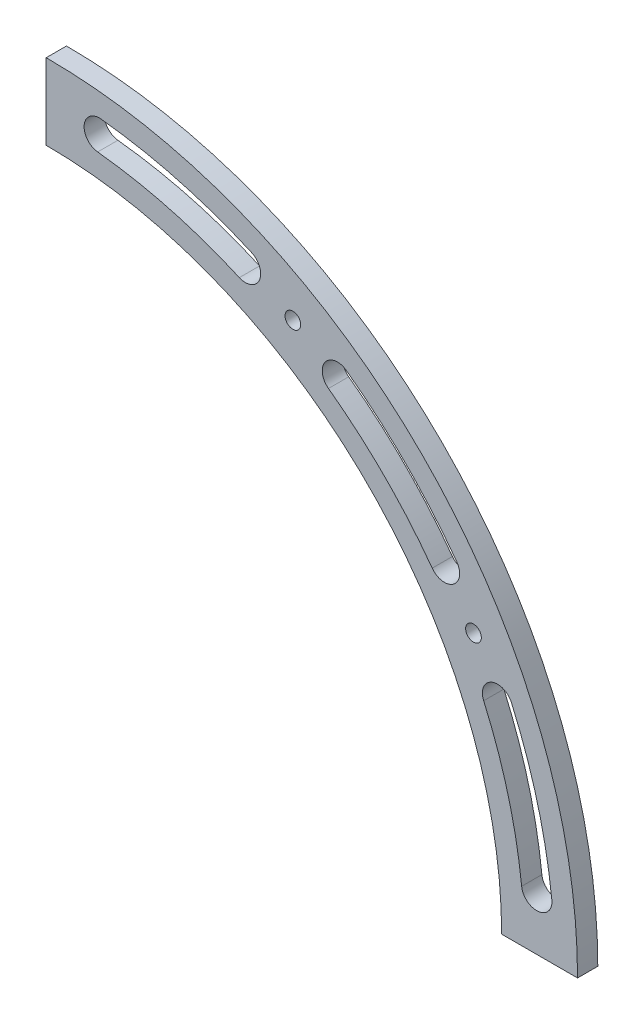
ISO-10303-21;
HEADER;
FILE_DESCRIPTION(('STEP AP214'),'2;1');
FILE_NAME('part.step','',(''),(''),'','','');
FILE_SCHEMA(('AUTOMOTIVE_DESIGN { 1 0 10303 214 1 1 1 1 }'));
ENDSEC;
DATA;
#1=APPLICATION_CONTEXT('core data for automotive mechanical design processes');
#2=APPLICATION_PROTOCOL_DEFINITION('international standard','automotive_design',2000,#1);
#3=PRODUCT_CONTEXT('',#1,'mechanical');
#4=PRODUCT('Part','Part','',(#3));
#5=PRODUCT_RELATED_PRODUCT_CATEGORY('part','',(#4));
#6=PRODUCT_DEFINITION_FORMATION('','',#4);
#7=PRODUCT_DEFINITION_CONTEXT('part definition',#1,'design');
#8=PRODUCT_DEFINITION('design','',#6,#7);
#9=PRODUCT_DEFINITION_SHAPE('','',#8);
#10=(LENGTH_UNIT() NAMED_UNIT(*) SI_UNIT(.MILLI.,.METRE.));
#11=(NAMED_UNIT(*) PLANE_ANGLE_UNIT() SI_UNIT($,.RADIAN.));
#12=(NAMED_UNIT(*) SI_UNIT($,.STERADIAN.) SOLID_ANGLE_UNIT());
#13=UNCERTAINTY_MEASURE_WITH_UNIT(LENGTH_MEASURE(1.E-05),#10,'distance_accuracy_value','');
#14=(GEOMETRIC_REPRESENTATION_CONTEXT(3) GLOBAL_UNCERTAINTY_ASSIGNED_CONTEXT((#13)) GLOBAL_UNIT_ASSIGNED_CONTEXT((#10,
#11,#12)) REPRESENTATION_CONTEXT('',''));
#15=CARTESIAN_POINT('',(0.,0.,0.));
#16=DIRECTION('',(0.,0.,1.));
#17=DIRECTION('',(1.,0.,0.));
#18=AXIS2_PLACEMENT_3D('',#15,#16,#17);
#19=CARTESIAN_POINT('',(0.,0.,0.));
#20=DIRECTION('',(0.,0.,-1.));
#21=DIRECTION('',(-1.,0.,0.));
#22=AXIS2_PLACEMENT_3D('',#19,#20,#21);
#23=PLANE('',#22);
#24=CARTESIAN_POINT('',(39.382176801012,89.1924556810375,0.));
#25=DIRECTION('',(0.,0.,-1.));
#26=DIRECTION('',(-1.,0.,0.));
#27=AXIS2_PLACEMENT_3D('',#24,#25,#26);
#28=CIRCLE('',#27,3.);
#29=CARTESIAN_POINT('',(40.593936087197,91.9368389327617,0.));
#30=VERTEX_POINT('',#29);
#31=CARTESIAN_POINT('',(38.170417514827,86.4480724293132,0.));
#32=VERTEX_POINT('',#31);
#33=EDGE_CURVE('E12',#30,#32,#28,.T.);
#34=ORIENTED_EDGE('',*,*,#33,.F.);
#35=CARTESIAN_POINT('',(0.,0.,0.));
#36=DIRECTION('',(0.,0.,-1.));
#37=DIRECTION('',(-1.,0.,0.));
#38=AXIS2_PLACEMENT_3D('',#35,#36,#37);
#39=CIRCLE('',#38,100.5);
#40=CARTESIAN_POINT('',(10.8130395752672,99.9166061030083,0.));
#41=VERTEX_POINT('',#40);
#42=EDGE_CURVE('E199',#41,#30,#39,.T.);
#43=ORIENTED_EDGE('',*,*,#42,.F.);
#44=CARTESIAN_POINT('',(10.4902622745129,96.934020846202,0.));
#45=DIRECTION('',(0.,0.,-1.));
#46=DIRECTION('',(-1.,0.,0.));
#47=AXIS2_PLACEMENT_3D('',#44,#45,#46);
#48=CIRCLE('',#47,3.);
#49=CARTESIAN_POINT('',(10.1674849737587,93.9514355893958,0.));
#50=VERTEX_POINT('',#49);
#51=EDGE_CURVE('E208',#50,#41,#48,.T.);
#52=ORIENTED_EDGE('',*,*,#51,.F.);
#53=CARTESIAN_POINT('',(0.,0.,0.));
#54=DIRECTION('',(0.,0.,-1.));
#55=DIRECTION('',(-1.,0.,0.));
#56=AXIS2_PLACEMENT_3D('',#53,#54,#55);
#57=CIRCLE('',#56,94.5);
#58=EDGE_CURVE('E49',#32,#50,#57,.F.);
#59=ORIENTED_EDGE('',*,*,#58,.F.);
#60=EDGE_LOOP('',(#34,#43,#52,#59));
#61=FACE_BOUND('',#60,.T.);
#62=CARTESIAN_POINT('',(84.4374768689824,48.7500000000007,0.));
#63=DIRECTION('',(0.,0.,-1.));
#64=DIRECTION('',(-1.,0.,0.));
#65=AXIS2_PLACEMENT_3D('',#62,#63,#64);
#66=CIRCLE('',#65,1.54999999999999);
#67=CARTESIAN_POINT('',(82.8874768689824,48.7500000000007,0.));
#68=VERTEX_POINT('',#67);
#69=EDGE_CURVE('E203',#68,#68,#66,.T.);
#70=ORIENTED_EDGE('',*,*,#69,.F.);
#71=EDGE_LOOP('',(#70));
#72=FACE_BOUND('',#71,.T.);
#73=CARTESIAN_POINT('',(48.7500000000004,84.4374768689825,0.));
#74=DIRECTION('',(0.,0.,-1.));
#75=DIRECTION('',(-1.,0.,0.));
#76=AXIS2_PLACEMENT_3D('',#73,#74,#75);
#77=CIRCLE('',#76,1.54999999999999);
#78=CARTESIAN_POINT('',(47.2000000000004,84.4374768689825,0.));
#79=VERTEX_POINT('',#78);
#80=EDGE_CURVE('E200',#79,#79,#77,.T.);
#81=ORIENTED_EDGE('',*,*,#80,.F.);
#82=EDGE_LOOP('',(#81));
#83=FACE_BOUND('',#82,.T.);
#84=CARTESIAN_POINT('',(96.9340208462021,10.4902622745126,0.));
#85=DIRECTION('',(0.,0.,-1.));
#86=DIRECTION('',(-1.,0.,0.));
#87=AXIS2_PLACEMENT_3D('',#84,#85,#86);
#88=CIRCLE('',#87,3.);
#89=CARTESIAN_POINT('',(99.9166061030083,10.8130395752669,0.));
#90=VERTEX_POINT('',#89);
#91=CARTESIAN_POINT('',(93.9514355893959,10.1674849737584,0.));
#92=VERTEX_POINT('',#91);
#93=EDGE_CURVE('E197',#90,#92,#88,.T.);
#94=ORIENTED_EDGE('',*,*,#93,.F.);
#95=CARTESIAN_POINT('',(0.,0.,0.));
#96=DIRECTION('',(0.,0.,-1.));
#97=DIRECTION('',(-1.,0.,0.));
#98=AXIS2_PLACEMENT_3D('',#95,#96,#97);
#99=CIRCLE('',#98,100.5);
#100=CARTESIAN_POINT('',(91.9368389327618,40.5939360871967,0.));
#101=VERTEX_POINT('',#100);
#102=EDGE_CURVE('E190',#101,#90,#99,.T.);
#103=ORIENTED_EDGE('',*,*,#102,.F.);
#104=CARTESIAN_POINT('',(89.1924556810376,39.3821768010117,0.));
#105=DIRECTION('',(0.,0.,-1.));
#106=DIRECTION('',(-1.,0.,0.));
#107=AXIS2_PLACEMENT_3D('',#104,#105,#106);
#108=CIRCLE('',#107,3.);
#109=CARTESIAN_POINT('',(86.4480724293134,38.1704175148268,0.));
#110=VERTEX_POINT('',#109);
#111=EDGE_CURVE('E192',#110,#101,#108,.T.);
#112=ORIENTED_EDGE('',*,*,#111,.F.);
#113=CARTESIAN_POINT('',(0.,0.,0.));
#114=DIRECTION('',(0.,0.,-1.));
#115=DIRECTION('',(-1.,0.,0.));
#116=AXIS2_PLACEMENT_3D('',#113,#114,#115);
#117=CIRCLE('',#116,94.5);
#118=EDGE_CURVE('E195',#92,#110,#117,.F.);
#119=ORIENTED_EDGE('',*,*,#118,.F.);
#120=EDGE_LOOP('',(#94,#103,#112,#119));
#121=FACE_BOUND('',#120,.T.);
#122=CARTESIAN_POINT('',(78.702193406525,57.5518440451906,0.));
#123=DIRECTION('',(0.,0.,-1.));
#124=DIRECTION('',(-1.,0.,0.));
#125=AXIS2_PLACEMENT_3D('',#122,#123,#124);
#126=CIRCLE('',#125,2.99999999999999);
#127=CARTESIAN_POINT('',(81.1237993574949,59.3226700158118,0.));
#128=VERTEX_POINT('',#127);
#129=CARTESIAN_POINT('',(76.280587455555,55.7810180745693,0.));
#130=VERTEX_POINT('',#129);
#131=EDGE_CURVE('E188',#128,#130,#126,.T.);
#132=ORIENTED_EDGE('',*,*,#131,.F.);
#133=CARTESIAN_POINT('',(0.,0.,0.));
#134=DIRECTION('',(0.,0.,-1.));
#135=DIRECTION('',(-1.,0.,0.));
#136=AXIS2_PLACEMENT_3D('',#133,#134,#135);
#137=CIRCLE('',#136,100.5);
#138=CARTESIAN_POINT('',(59.3226700158115,81.1237993574952,0.));
#139=VERTEX_POINT('',#138);
#140=EDGE_CURVE('E176',#139,#128,#137,.T.);
#141=ORIENTED_EDGE('',*,*,#140,.F.);
#142=CARTESIAN_POINT('',(57.5518440451903,78.7021934065252,0.));
#143=DIRECTION('',(0.,0.,-1.));
#144=DIRECTION('',(-1.,0.,0.));
#145=AXIS2_PLACEMENT_3D('',#142,#143,#144);
#146=CIRCLE('',#145,2.99999999999999);
#147=CARTESIAN_POINT('',(55.781018074569,76.2805874555552,0.));
#148=VERTEX_POINT('',#147);
#149=EDGE_CURVE('E178',#148,#139,#146,.T.);
#150=ORIENTED_EDGE('',*,*,#149,.F.);
#151=CARTESIAN_POINT('',(0.,0.,0.));
#152=DIRECTION('',(0.,0.,-1.));
#153=DIRECTION('',(-1.,0.,0.));
#154=AXIS2_PLACEMENT_3D('',#151,#152,#153);
#155=CIRCLE('',#154,94.5);
#156=EDGE_CURVE('E186',#130,#148,#155,.F.);
#157=ORIENTED_EDGE('',*,*,#156,.F.);
#158=EDGE_LOOP('',(#132,#141,#150,#157));
#159=FACE_BOUND('',#158,.T.);
#160=CARTESIAN_POINT('',(0.,0.,0.));
#161=DIRECTION('',(0.,0.,1.));
#162=DIRECTION('',(-1.,0.,0.));
#163=AXIS2_PLACEMENT_3D('',#160,#161,#162);
#164=CIRCLE('',#163,105.);
#165=CARTESIAN_POINT('',(105.,0.,0.));
#166=VERTEX_POINT('',#165);
#167=CARTESIAN_POINT('',(0.,105.,0.));
#168=VERTEX_POINT('',#167);
#169=EDGE_CURVE('E175',#166,#168,#164,.T.);
#170=ORIENTED_EDGE('',*,*,#169,.F.);
#171=DIRECTION('',(-1.,0.,0.));
#172=VECTOR('',#171,1.);
#173=CARTESIAN_POINT('',(0.,0.,0.));
#174=LINE('',#173,#172);
#175=CARTESIAN_POINT('',(90.,0.,0.));
#176=VERTEX_POINT('',#175);
#177=EDGE_CURVE('E268',#166,#176,#174,.T.);
#178=ORIENTED_EDGE('',*,*,#177,.T.);
#179=CARTESIAN_POINT('',(0.,0.,0.));
#180=DIRECTION('',(0.,0.,-1.));
#181=DIRECTION('',(-1.,0.,0.));
#182=AXIS2_PLACEMENT_3D('',#179,#180,#181);
#183=CIRCLE('',#182,90.);
#184=CARTESIAN_POINT('',(0.,90.,0.));
#185=VERTEX_POINT('',#184);
#186=EDGE_CURVE('E272',#185,#176,#183,.T.);
#187=ORIENTED_EDGE('',*,*,#186,.F.);
#188=DIRECTION('',(0.,-1.,0.));
#189=VECTOR('',#188,1.);
#190=CARTESIAN_POINT('',(0.,105.,0.));
#191=LINE('',#190,#189);
#192=EDGE_CURVE('E270',#168,#185,#191,.T.);
#193=ORIENTED_EDGE('',*,*,#192,.F.);
#194=EDGE_LOOP('',(#170,#178,#187,#193));
#195=FACE_BOUND('',#194,.T.);
#196=ADVANCED_FACE('F41',(#61,#72,#83,#121,#159,#195),#23,.T.);
#197=CARTESIAN_POINT('',(0.,0.,15.));
#198=DIRECTION('',(0.,0.,-1.));
#199=DIRECTION('',(-1.,0.,0.));
#200=AXIS2_PLACEMENT_3D('',#197,#198,#199);
#201=CYLINDRICAL_SURFACE('',#200,105.);
#202=DIRECTION('',(0.,0.,-1.));
#203=VECTOR('',#202,1.);
#204=CARTESIAN_POINT('',(0.,105.,15.));
#205=LINE('',#204,#203);
#206=CARTESIAN_POINT('',(0.,105.,4.));
#207=VERTEX_POINT('',#206);
#208=EDGE_CURVE('E168',#207,#168,#205,.T.);
#209=ORIENTED_EDGE('',*,*,#208,.F.);
#210=CARTESIAN_POINT('',(0.,0.,4.));
#211=DIRECTION('',(0.,0.,1.));
#212=DIRECTION('',(-1.,0.,0.));
#213=AXIS2_PLACEMENT_3D('',#210,#211,#212);
#214=CIRCLE('',#213,105.);
#215=CARTESIAN_POINT('',(105.,0.,4.));
#216=VERTEX_POINT('',#215);
#217=EDGE_CURVE('E152',#216,#207,#214,.T.);
#218=ORIENTED_EDGE('',*,*,#217,.F.);
#219=DIRECTION('',(0.,0.,-1.));
#220=VECTOR('',#219,1.);
#221=CARTESIAN_POINT('',(105.,0.,15.));
#222=LINE('',#221,#220);
#223=EDGE_CURVE('E275',#216,#166,#222,.T.);
#224=ORIENTED_EDGE('',*,*,#223,.T.);
#225=ORIENTED_EDGE('',*,*,#169,.T.);
#226=EDGE_LOOP('',(#209,#218,#224,#225));
#227=FACE_BOUND('',#226,.T.);
#228=ADVANCED_FACE('F43',(#227),#201,.T.);
#229=CARTESIAN_POINT('',(0.,105.,15.));
#230=DIRECTION('',(1.,0.,0.));
#231=DIRECTION('',(0.,1.,0.));
#232=AXIS2_PLACEMENT_3D('',#229,#230,#231);
#233=PLANE('',#232);
#234=DIRECTION('',(0.,0.,-1.));
#235=VECTOR('',#234,1.);
#236=CARTESIAN_POINT('',(0.,90.,15.));
#237=LINE('',#236,#235);
#238=CARTESIAN_POINT('',(0.,90.,4.));
#239=VERTEX_POINT('',#238);
#240=EDGE_CURVE('E170',#239,#185,#237,.T.);
#241=ORIENTED_EDGE('',*,*,#240,.F.);
#242=DIRECTION('',(0.,-1.,0.));
#243=VECTOR('',#242,1.);
#244=CARTESIAN_POINT('',(0.,105.,4.));
#245=LINE('',#244,#243);
#246=EDGE_CURVE('E156',#207,#239,#245,.T.);
#247=ORIENTED_EDGE('',*,*,#246,.F.);
#248=ORIENTED_EDGE('',*,*,#208,.T.);
#249=ORIENTED_EDGE('',*,*,#192,.T.);
#250=EDGE_LOOP('',(#241,#247,#248,#249));
#251=FACE_BOUND('',#250,.T.);
#252=ADVANCED_FACE('F166',(#251),#233,.F.);
#253=CARTESIAN_POINT('',(0.,0.,15.));
#254=DIRECTION('',(0.,0.,-1.));
#255=DIRECTION('',(-1.,0.,0.));
#256=AXIS2_PLACEMENT_3D('',#253,#254,#255);
#257=CYLINDRICAL_SURFACE('',#256,90.);
#258=DIRECTION('',(0.,0.,-1.));
#259=VECTOR('',#258,1.);
#260=CARTESIAN_POINT('',(90.,0.,15.));
#261=LINE('',#260,#259);
#262=CARTESIAN_POINT('',(90.,0.,4.));
#263=VERTEX_POINT('',#262);
#264=EDGE_CURVE('E180',#263,#176,#261,.T.);
#265=ORIENTED_EDGE('',*,*,#264,.F.);
#266=CARTESIAN_POINT('',(0.,0.,4.));
#267=DIRECTION('',(0.,0.,-1.));
#268=DIRECTION('',(-1.,0.,0.));
#269=AXIS2_PLACEMENT_3D('',#266,#267,#268);
#270=CIRCLE('',#269,90.);
#271=EDGE_CURVE('E171',#239,#263,#270,.T.);
#272=ORIENTED_EDGE('',*,*,#271,.F.);
#273=ORIENTED_EDGE('',*,*,#240,.T.);
#274=ORIENTED_EDGE('',*,*,#186,.T.);
#275=EDGE_LOOP('',(#265,#272,#273,#274));
#276=FACE_BOUND('',#275,.T.);
#277=ADVANCED_FACE('F286',(#276),#257,.F.);
#278=CARTESIAN_POINT('',(78.702193406525,57.5518440451906,-50.));
#279=DIRECTION('',(0.,0.,1.));
#280=DIRECTION('',(1.,0.,0.));
#281=AXIS2_PLACEMENT_3D('',#278,#279,#280);
#282=CYLINDRICAL_SURFACE('',#281,2.99999999999999);
#283=DIRECTION('',(0.,0.,1.));
#284=VECTOR('',#283,1.);
#285=CARTESIAN_POINT('',(76.280587455555,55.7810180745693,-50.));
#286=LINE('',#285,#284);
#287=CARTESIAN_POINT('',(76.280587455555,55.7810180745693,4.));
#288=VERTEX_POINT('',#287);
#289=EDGE_CURVE('E253',#130,#288,#286,.T.);
#290=ORIENTED_EDGE('',*,*,#289,.T.);
#291=CARTESIAN_POINT('',(78.702193406525,57.5518440451906,4.));
#292=DIRECTION('',(0.,0.,-1.));
#293=DIRECTION('',(-1.,0.,0.));
#294=AXIS2_PLACEMENT_3D('',#291,#292,#293);
#295=CIRCLE('',#294,2.99999999999999);
#296=CARTESIAN_POINT('',(81.1237993574949,59.3226700158118,4.));
#297=VERTEX_POINT('',#296);
#298=EDGE_CURVE('E284',#288,#297,#295,.F.);
#299=ORIENTED_EDGE('',*,*,#298,.T.);
#300=DIRECTION('',(0.,0.,1.));
#301=VECTOR('',#300,1.);
#302=CARTESIAN_POINT('',(81.1237993574949,59.3226700158118,-50.));
#303=LINE('',#302,#301);
#304=EDGE_CURVE('E241',#128,#297,#303,.T.);
#305=ORIENTED_EDGE('',*,*,#304,.F.);
#306=ORIENTED_EDGE('',*,*,#131,.T.);
#307=EDGE_LOOP('',(#290,#299,#305,#306));
#308=FACE_BOUND('',#307,.T.);
#309=ADVANCED_FACE('F321',(#308),#282,.F.);
#310=CARTESIAN_POINT('',(0.,0.,-50.));
#311=DIRECTION('',(0.,0.,1.));
#312=DIRECTION('',(1.,0.,0.));
#313=AXIS2_PLACEMENT_3D('',#310,#311,#312);
#314=CYLINDRICAL_SURFACE('',#313,94.5);
#315=DIRECTION('',(0.,0.,1.));
#316=VECTOR('',#315,1.);
#317=CARTESIAN_POINT('',(55.781018074569,76.2805874555552,-50.));
#318=LINE('',#317,#316);
#319=CARTESIAN_POINT('',(55.781018074569,76.2805874555552,4.));
#320=VERTEX_POINT('',#319);
#321=EDGE_CURVE('E250',#148,#320,#318,.T.);
#322=ORIENTED_EDGE('',*,*,#321,.T.);
#323=CARTESIAN_POINT('',(0.,0.,4.));
#324=DIRECTION('',(0.,0.,-1.));
#325=DIRECTION('',(-1.,0.,0.));
#326=AXIS2_PLACEMENT_3D('',#323,#324,#325);
#327=CIRCLE('',#326,94.5);
#328=EDGE_CURVE('E314',#320,#288,#327,.T.);
#329=ORIENTED_EDGE('',*,*,#328,.T.);
#330=ORIENTED_EDGE('',*,*,#289,.F.);
#331=ORIENTED_EDGE('',*,*,#156,.T.);
#332=EDGE_LOOP('',(#322,#329,#330,#331));
#333=FACE_BOUND('',#332,.T.);
#334=ADVANCED_FACE('F331',(#333),#314,.T.);
#335=CARTESIAN_POINT('',(57.5518440451903,78.7021934065252,-50.));
#336=DIRECTION('',(0.,0.,1.));
#337=DIRECTION('',(1.,0.,0.));
#338=AXIS2_PLACEMENT_3D('',#335,#336,#337);
#339=CYLINDRICAL_SURFACE('',#338,2.99999999999999);
#340=DIRECTION('',(0.,0.,1.));
#341=VECTOR('',#340,1.);
#342=CARTESIAN_POINT('',(59.3226700158115,81.1237993574952,-50.));
#343=LINE('',#342,#341);
#344=CARTESIAN_POINT('',(59.3226700158115,81.1237993574952,4.));
#345=VERTEX_POINT('',#344);
#346=EDGE_CURVE('E245',#139,#345,#343,.T.);
#347=ORIENTED_EDGE('',*,*,#346,.T.);
#348=CARTESIAN_POINT('',(57.5518440451903,78.7021934065252,4.));
#349=DIRECTION('',(0.,0.,-1.));
#350=DIRECTION('',(-1.,0.,0.));
#351=AXIS2_PLACEMENT_3D('',#348,#349,#350);
#352=CIRCLE('',#351,2.99999999999999);
#353=EDGE_CURVE('E56',#345,#320,#352,.F.);
#354=ORIENTED_EDGE('',*,*,#353,.T.);
#355=ORIENTED_EDGE('',*,*,#321,.F.);
#356=ORIENTED_EDGE('',*,*,#149,.T.);
#357=EDGE_LOOP('',(#347,#354,#355,#356));
#358=FACE_BOUND('',#357,.T.);
#359=ADVANCED_FACE('F334',(#358),#339,.F.);
#360=CARTESIAN_POINT('',(0.,0.,-50.));
#361=DIRECTION('',(0.,0.,1.));
#362=DIRECTION('',(1.,0.,0.));
#363=AXIS2_PLACEMENT_3D('',#360,#361,#362);
#364=CYLINDRICAL_SURFACE('',#363,100.5);
#365=ORIENTED_EDGE('',*,*,#304,.T.);
#366=CARTESIAN_POINT('',(0.,0.,4.));
#367=DIRECTION('',(0.,0.,-1.));
#368=DIRECTION('',(-1.,0.,0.));
#369=AXIS2_PLACEMENT_3D('',#366,#367,#368);
#370=CIRCLE('',#369,100.5);
#371=EDGE_CURVE('E311',#297,#345,#370,.F.);
#372=ORIENTED_EDGE('',*,*,#371,.T.);
#373=ORIENTED_EDGE('',*,*,#346,.F.);
#374=ORIENTED_EDGE('',*,*,#140,.T.);
#375=EDGE_LOOP('',(#365,#372,#373,#374));
#376=FACE_BOUND('',#375,.T.);
#377=ADVANCED_FACE('F325',(#376),#364,.F.);
#378=CARTESIAN_POINT('',(96.9340208462021,10.4902622745126,-50.));
#379=DIRECTION('',(0.,0.,1.));
#380=DIRECTION('',(1.,0.,0.));
#381=AXIS2_PLACEMENT_3D('',#378,#379,#380);
#382=CYLINDRICAL_SURFACE('',#381,3.);
#383=DIRECTION('',(0.,0.,1.));
#384=VECTOR('',#383,1.);
#385=CARTESIAN_POINT('',(93.9514355893959,10.1674849737584,-50.));
#386=LINE('',#385,#384);
#387=CARTESIAN_POINT('',(93.9514355893959,10.1674849737584,4.));
#388=VERTEX_POINT('',#387);
#389=EDGE_CURVE('E265',#92,#388,#386,.T.);
#390=ORIENTED_EDGE('',*,*,#389,.T.);
#391=CARTESIAN_POINT('',(96.9340208462021,10.4902622745126,4.));
#392=DIRECTION('',(0.,0.,-1.));
#393=DIRECTION('',(-1.,0.,0.));
#394=AXIS2_PLACEMENT_3D('',#391,#392,#393);
#395=CIRCLE('',#394,3.);
#396=CARTESIAN_POINT('',(99.9166061030083,10.8130395752669,4.));
#397=VERTEX_POINT('',#396);
#398=EDGE_CURVE('E308',#388,#397,#395,.F.);
#399=ORIENTED_EDGE('',*,*,#398,.T.);
#400=DIRECTION('',(0.,0.,1.));
#401=VECTOR('',#400,1.);
#402=CARTESIAN_POINT('',(99.9166061030083,10.8130395752669,-50.));
#403=LINE('',#402,#401);
#404=EDGE_CURVE('E256',#90,#397,#403,.T.);
#405=ORIENTED_EDGE('',*,*,#404,.F.);
#406=ORIENTED_EDGE('',*,*,#93,.T.);
#407=EDGE_LOOP('',(#390,#399,#405,#406));
#408=FACE_BOUND('',#407,.T.);
#409=ADVANCED_FACE('F341',(#408),#382,.F.);
#410=CARTESIAN_POINT('',(0.,0.,-50.));
#411=DIRECTION('',(0.,0.,1.));
#412=DIRECTION('',(1.,0.,0.));
#413=AXIS2_PLACEMENT_3D('',#410,#411,#412);
#414=CYLINDRICAL_SURFACE('',#413,94.5);
#415=DIRECTION('',(0.,0.,1.));
#416=VECTOR('',#415,1.);
#417=CARTESIAN_POINT('',(86.4480724293134,38.1704175148268,-50.));
#418=LINE('',#417,#416);
#419=CARTESIAN_POINT('',(86.4480724293134,38.1704175148268,4.));
#420=VERTEX_POINT('',#419);
#421=EDGE_CURVE('E262',#110,#420,#418,.T.);
#422=ORIENTED_EDGE('',*,*,#421,.T.);
#423=CARTESIAN_POINT('',(0.,0.,4.));
#424=DIRECTION('',(0.,0.,-1.));
#425=DIRECTION('',(-1.,0.,0.));
#426=AXIS2_PLACEMENT_3D('',#423,#424,#425);
#427=CIRCLE('',#426,94.5);
#428=EDGE_CURVE('E305',#420,#388,#427,.T.);
#429=ORIENTED_EDGE('',*,*,#428,.T.);
#430=ORIENTED_EDGE('',*,*,#389,.F.);
#431=ORIENTED_EDGE('',*,*,#118,.T.);
#432=EDGE_LOOP('',(#422,#429,#430,#431));
#433=FACE_BOUND('',#432,.T.);
#434=ADVANCED_FACE('F351',(#433),#414,.T.);
#435=CARTESIAN_POINT('',(89.1924556810376,39.3821768010117,-50.));
#436=DIRECTION('',(0.,0.,1.));
#437=DIRECTION('',(1.,0.,0.));
#438=AXIS2_PLACEMENT_3D('',#435,#436,#437);
#439=CYLINDRICAL_SURFACE('',#438,3.);
#440=DIRECTION('',(0.,0.,1.));
#441=VECTOR('',#440,1.);
#442=CARTESIAN_POINT('',(91.9368389327619,40.5939360871967,-50.));
#443=LINE('',#442,#441);
#444=CARTESIAN_POINT('',(91.9368389327619,40.5939360871967,4.));
#445=VERTEX_POINT('',#444);
#446=EDGE_CURVE('E259',#101,#445,#443,.T.);
#447=ORIENTED_EDGE('',*,*,#446,.T.);
#448=CARTESIAN_POINT('',(89.1924556810376,39.3821768010117,4.));
#449=DIRECTION('',(0.,0.,-1.));
#450=DIRECTION('',(-1.,0.,0.));
#451=AXIS2_PLACEMENT_3D('',#448,#449,#450);
#452=CIRCLE('',#451,3.);
#453=EDGE_CURVE('E64',#445,#420,#452,.F.);
#454=ORIENTED_EDGE('',*,*,#453,.T.);
#455=ORIENTED_EDGE('',*,*,#421,.F.);
#456=ORIENTED_EDGE('',*,*,#111,.T.);
#457=EDGE_LOOP('',(#447,#454,#455,#456));
#458=FACE_BOUND('',#457,.T.);
#459=ADVANCED_FACE('F405',(#458),#439,.F.);
#460=CARTESIAN_POINT('',(0.,0.,-50.));
#461=DIRECTION('',(0.,0.,1.));
#462=DIRECTION('',(1.,0.,0.));
#463=AXIS2_PLACEMENT_3D('',#460,#461,#462);
#464=CYLINDRICAL_SURFACE('',#463,100.5);
#465=ORIENTED_EDGE('',*,*,#404,.T.);
#466=CARTESIAN_POINT('',(0.,0.,4.));
#467=DIRECTION('',(0.,0.,-1.));
#468=DIRECTION('',(-1.,0.,0.));
#469=AXIS2_PLACEMENT_3D('',#466,#467,#468);
#470=CIRCLE('',#469,100.5);
#471=EDGE_CURVE('E302',#397,#445,#470,.F.);
#472=ORIENTED_EDGE('',*,*,#471,.T.);
#473=ORIENTED_EDGE('',*,*,#446,.F.);
#474=ORIENTED_EDGE('',*,*,#102,.T.);
#475=EDGE_LOOP('',(#465,#472,#473,#474));
#476=FACE_BOUND('',#475,.T.);
#477=ADVANCED_FACE('F414',(#476),#464,.F.);
#478=CARTESIAN_POINT('',(48.7500000000004,84.4374768689825,-50.));
#479=DIRECTION('',(0.,0.,1.));
#480=DIRECTION('',(1.,0.,0.));
#481=AXIS2_PLACEMENT_3D('',#478,#479,#480);
#482=CYLINDRICAL_SURFACE('',#481,1.54999999999999);
#483=CARTESIAN_POINT('',(48.7500000000004,84.4374768689825,4.));
#484=DIRECTION('',(0.,0.,-1.));
#485=DIRECTION('',(-1.,0.,0.));
#486=AXIS2_PLACEMENT_3D('',#483,#484,#485);
#487=CIRCLE('',#486,1.54999999999999);
#488=CARTESIAN_POINT('',(47.2000000000004,84.4374768689825,4.));
#489=VERTEX_POINT('',#488);
#490=EDGE_CURVE('E299',#489,#489,#487,.F.);
#491=ORIENTED_EDGE('',*,*,#490,.T.);
#492=EDGE_LOOP('',(#491));
#493=FACE_BOUND('',#492,.T.);
#494=ORIENTED_EDGE('',*,*,#80,.T.);
#495=EDGE_LOOP('',(#494));
#496=FACE_BOUND('',#495,.T.);
#497=ADVANCED_FACE('F423',(#493,#496),#482,.F.);
#498=CARTESIAN_POINT('',(84.4374768689824,48.7500000000007,-50.));
#499=DIRECTION('',(0.,0.,1.));
#500=DIRECTION('',(1.,0.,0.));
#501=AXIS2_PLACEMENT_3D('',#498,#499,#500);
#502=CYLINDRICAL_SURFACE('',#501,1.54999999999999);
#503=CARTESIAN_POINT('',(84.4374768689824,48.7500000000007,4.));
#504=DIRECTION('',(0.,0.,-1.));
#505=DIRECTION('',(-1.,0.,0.));
#506=AXIS2_PLACEMENT_3D('',#503,#504,#505);
#507=CIRCLE('',#506,1.54999999999999);
#508=CARTESIAN_POINT('',(82.8874768689824,48.7500000000007,4.));
#509=VERTEX_POINT('',#508);
#510=EDGE_CURVE('E296',#509,#509,#507,.F.);
#511=ORIENTED_EDGE('',*,*,#510,.T.);
#512=EDGE_LOOP('',(#511));
#513=FACE_BOUND('',#512,.T.);
#514=ORIENTED_EDGE('',*,*,#69,.T.);
#515=EDGE_LOOP('',(#514));
#516=FACE_BOUND('',#515,.T.);
#517=ADVANCED_FACE('F433',(#513,#516),#502,.F.);
#518=CARTESIAN_POINT('',(39.382176801012,89.1924556810375,-50.));
#519=DIRECTION('',(0.,0.,1.));
#520=DIRECTION('',(1.,0.,0.));
#521=AXIS2_PLACEMENT_3D('',#518,#519,#520);
#522=CYLINDRICAL_SURFACE('',#521,3.);
#523=DIRECTION('',(0.,0.,1.));
#524=VECTOR('',#523,1.);
#525=CARTESIAN_POINT('',(38.170417514827,86.4480724293132,-50.));
#526=LINE('',#525,#524);
#527=CARTESIAN_POINT('',(38.170417514827,86.4480724293132,4.));
#528=VERTEX_POINT('',#527);
#529=EDGE_CURVE('E204',#32,#528,#526,.T.);
#530=ORIENTED_EDGE('',*,*,#529,.T.);
#531=CARTESIAN_POINT('',(39.382176801012,89.1924556810375,4.));
#532=DIRECTION('',(0.,0.,-1.));
#533=DIRECTION('',(-1.,0.,0.));
#534=AXIS2_PLACEMENT_3D('',#531,#532,#533);
#535=CIRCLE('',#534,3.);
#536=CARTESIAN_POINT('',(40.593936087197,91.9368389327617,4.));
#537=VERTEX_POINT('',#536);
#538=EDGE_CURVE('E240',#528,#537,#535,.F.);
#539=ORIENTED_EDGE('',*,*,#538,.T.);
#540=DIRECTION('',(0.,0.,1.));
#541=VECTOR('',#540,1.);
#542=CARTESIAN_POINT('',(40.593936087197,91.9368389327617,-50.));
#543=LINE('',#542,#541);
#544=EDGE_CURVE('E236',#30,#537,#543,.T.);
#545=ORIENTED_EDGE('',*,*,#544,.F.);
#546=ORIENTED_EDGE('',*,*,#33,.T.);
#547=EDGE_LOOP('',(#530,#539,#545,#546));
#548=FACE_BOUND('',#547,.T.);
#549=ADVANCED_FACE('F239',(#548),#522,.F.);
#550=CARTESIAN_POINT('',(0.,0.,-50.));
#551=DIRECTION('',(0.,0.,1.));
#552=DIRECTION('',(1.,0.,0.));
#553=AXIS2_PLACEMENT_3D('',#550,#551,#552);
#554=CYLINDRICAL_SURFACE('',#553,94.5);
#555=DIRECTION('',(0.,0.,1.));
#556=VECTOR('',#555,1.);
#557=CARTESIAN_POINT('',(10.1674849737587,93.9514355893958,-50.));
#558=LINE('',#557,#556);
#559=CARTESIAN_POINT('',(10.1674849737587,93.9514355893958,4.));
#560=VERTEX_POINT('',#559);
#561=EDGE_CURVE('E217',#50,#560,#558,.T.);
#562=ORIENTED_EDGE('',*,*,#561,.T.);
#563=CARTESIAN_POINT('',(0.,0.,4.));
#564=DIRECTION('',(0.,0.,-1.));
#565=DIRECTION('',(-1.,0.,0.));
#566=AXIS2_PLACEMENT_3D('',#563,#564,#565);
#567=CIRCLE('',#566,94.5);
#568=EDGE_CURVE('E293',#560,#528,#567,.T.);
#569=ORIENTED_EDGE('',*,*,#568,.T.);
#570=ORIENTED_EDGE('',*,*,#529,.F.);
#571=ORIENTED_EDGE('',*,*,#58,.T.);
#572=EDGE_LOOP('',(#562,#569,#570,#571));
#573=FACE_BOUND('',#572,.T.);
#574=ADVANCED_FACE('F215',(#573),#554,.T.);
#575=CARTESIAN_POINT('',(10.4902622745129,96.934020846202,-50.));
#576=DIRECTION('',(0.,0.,1.));
#577=DIRECTION('',(1.,0.,0.));
#578=AXIS2_PLACEMENT_3D('',#575,#576,#577);
#579=CYLINDRICAL_SURFACE('',#578,3.);
#580=DIRECTION('',(0.,0.,1.));
#581=VECTOR('',#580,1.);
#582=CARTESIAN_POINT('',(10.8130395752672,99.9166061030083,-50.));
#583=LINE('',#582,#581);
#584=CARTESIAN_POINT('',(10.8130395752672,99.9166061030083,4.));
#585=VERTEX_POINT('',#584);
#586=EDGE_CURVE('E228',#41,#585,#583,.T.);
#587=ORIENTED_EDGE('',*,*,#586,.T.);
#588=CARTESIAN_POINT('',(10.4902622745129,96.934020846202,4.));
#589=DIRECTION('',(0.,0.,-1.));
#590=DIRECTION('',(-1.,0.,0.));
#591=AXIS2_PLACEMENT_3D('',#588,#589,#590);
#592=CIRCLE('',#591,3.);
#593=EDGE_CURVE('E227',#585,#560,#592,.F.);
#594=ORIENTED_EDGE('',*,*,#593,.T.);
#595=ORIENTED_EDGE('',*,*,#561,.F.);
#596=ORIENTED_EDGE('',*,*,#51,.T.);
#597=EDGE_LOOP('',(#587,#594,#595,#596));
#598=FACE_BOUND('',#597,.T.);
#599=ADVANCED_FACE('F225',(#598),#579,.F.);
#600=CARTESIAN_POINT('',(0.,0.,-50.));
#601=DIRECTION('',(0.,0.,1.));
#602=DIRECTION('',(1.,0.,0.));
#603=AXIS2_PLACEMENT_3D('',#600,#601,#602);
#604=CYLINDRICAL_SURFACE('',#603,100.5);
#605=ORIENTED_EDGE('',*,*,#544,.T.);
#606=CARTESIAN_POINT('',(0.,0.,4.));
#607=DIRECTION('',(0.,0.,-1.));
#608=DIRECTION('',(-1.,0.,0.));
#609=AXIS2_PLACEMENT_3D('',#606,#607,#608);
#610=CIRCLE('',#609,100.5);
#611=EDGE_CURVE('E288',#537,#585,#610,.F.);
#612=ORIENTED_EDGE('',*,*,#611,.T.);
#613=ORIENTED_EDGE('',*,*,#586,.F.);
#614=ORIENTED_EDGE('',*,*,#42,.T.);
#615=EDGE_LOOP('',(#605,#612,#613,#614));
#616=FACE_BOUND('',#615,.T.);
#617=ADVANCED_FACE('F234',(#616),#604,.F.);
#618=CARTESIAN_POINT('',(90.,0.,-50.0000000000005));
#619=DIRECTION('',(0.,-1.,0.));
#620=DIRECTION('',(0.,0.,-1.));
#621=AXIS2_PLACEMENT_3D('',#618,#619,#620);
#622=PLANE('',#621);
#623=DIRECTION('',(1.,0.,0.));
#624=VECTOR('',#623,1.);
#625=CARTESIAN_POINT('',(90.,0.,4.));
#626=LINE('',#625,#624);
#627=EDGE_CURVE('E159',#263,#216,#626,.T.);
#628=ORIENTED_EDGE('',*,*,#627,.F.);
#629=ORIENTED_EDGE('',*,*,#264,.T.);
#630=ORIENTED_EDGE('',*,*,#177,.F.);
#631=ORIENTED_EDGE('',*,*,#223,.F.);
#632=EDGE_LOOP('',(#628,#629,#630,#631));
#633=FACE_BOUND('',#632,.T.);
#634=ADVANCED_FACE('F280',(#633),#622,.T.);
#635=CARTESIAN_POINT('',(0.,0.,4.));
#636=DIRECTION('',(0.,0.,-1.));
#637=DIRECTION('',(-1.,0.,0.));
#638=AXIS2_PLACEMENT_3D('',#635,#636,#637);
#639=PLANE('',#638);
#640=ORIENTED_EDGE('',*,*,#510,.F.);
#641=EDGE_LOOP('',(#640));
#642=FACE_BOUND('',#641,.T.);
#643=ORIENTED_EDGE('',*,*,#217,.T.);
#644=ORIENTED_EDGE('',*,*,#246,.T.);
#645=ORIENTED_EDGE('',*,*,#271,.T.);
#646=ORIENTED_EDGE('',*,*,#627,.T.);
#647=EDGE_LOOP('',(#643,#644,#645,#646));
#648=FACE_BOUND('',#647,.T.);
#649=ORIENTED_EDGE('',*,*,#568,.F.);
#650=ORIENTED_EDGE('',*,*,#593,.F.);
#651=ORIENTED_EDGE('',*,*,#611,.F.);
#652=ORIENTED_EDGE('',*,*,#538,.F.);
#653=EDGE_LOOP('',(#649,#650,#651,#652));
#654=FACE_BOUND('',#653,.T.);
#655=ORIENTED_EDGE('',*,*,#490,.F.);
#656=EDGE_LOOP('',(#655));
#657=FACE_BOUND('',#656,.T.);
#658=ORIENTED_EDGE('',*,*,#428,.F.);
#659=ORIENTED_EDGE('',*,*,#453,.F.);
#660=ORIENTED_EDGE('',*,*,#471,.F.);
#661=ORIENTED_EDGE('',*,*,#398,.F.);
#662=EDGE_LOOP('',(#658,#659,#660,#661));
#663=FACE_BOUND('',#662,.T.);
#664=ORIENTED_EDGE('',*,*,#328,.F.);
#665=ORIENTED_EDGE('',*,*,#353,.F.);
#666=ORIENTED_EDGE('',*,*,#371,.F.);
#667=ORIENTED_EDGE('',*,*,#298,.F.);
#668=EDGE_LOOP('',(#664,#665,#666,#667));
#669=FACE_BOUND('',#668,.T.);
#670=ADVANCED_FACE('F154',(#642,#648,#654,#657,#663,#669),#639,.F.);
#671=CLOSED_SHELL('',(#196,#228,#252,#277,#309,#334,#359,#377,#409,#434,#459,#477,#497,#517,
#549,#574,#599,#617,#634,#670));
#672=MANIFOLD_SOLID_BREP('B2',#671);
#673=ADVANCED_BREP_SHAPE_REPRESENTATION('',(#18,#672),#14);
#674=SHAPE_DEFINITION_REPRESENTATION(#9,#673);
ENDSEC;
END-ISO-10303-21;
